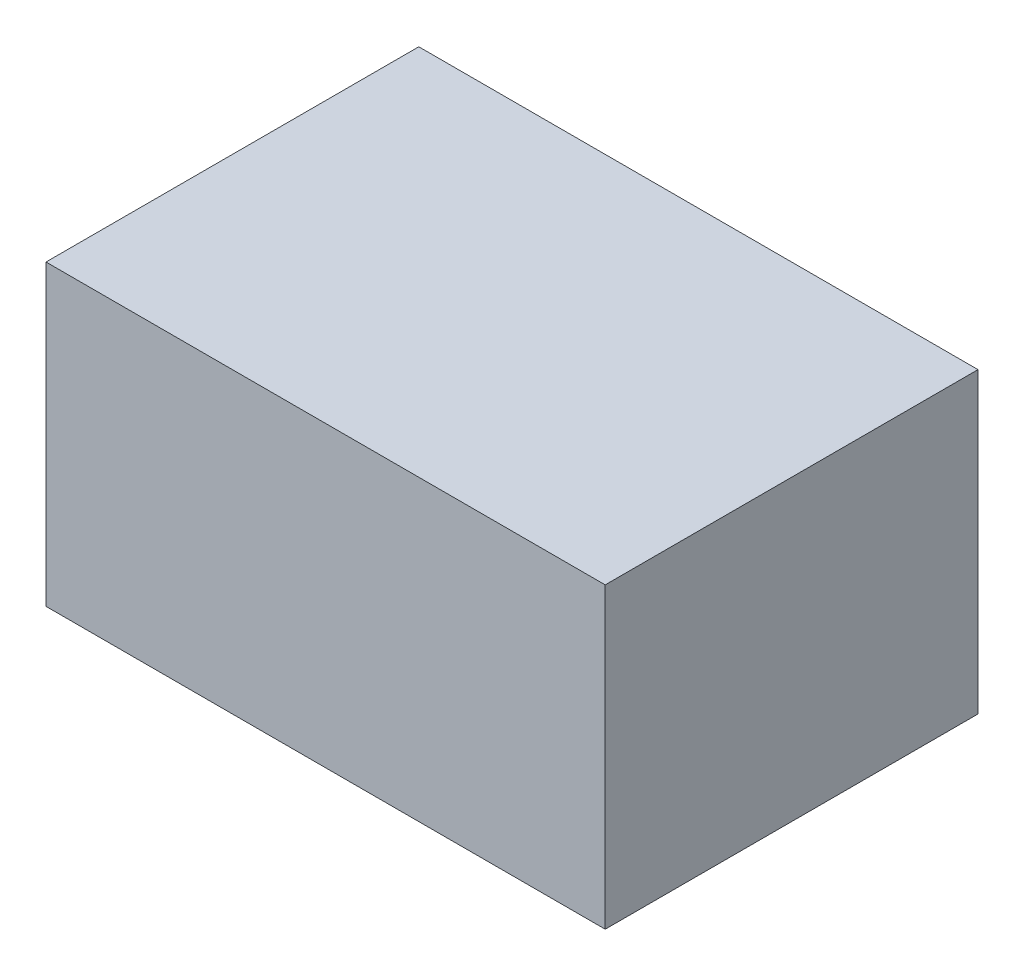
ISO-10303-21;
HEADER;
FILE_DESCRIPTION(('STEP AP214'),'2;1');
FILE_NAME('part.step','',(''),(''),'','','');
FILE_SCHEMA(('AUTOMOTIVE_DESIGN { 1 0 10303 214 1 1 1 1 }'));
ENDSEC;
DATA;
#1=APPLICATION_CONTEXT('core data for automotive mechanical design processes');
#2=APPLICATION_PROTOCOL_DEFINITION('international standard','automotive_design',2000,#1);
#3=PRODUCT_CONTEXT('',#1,'mechanical');
#4=PRODUCT('Part','Part','',(#3));
#5=PRODUCT_RELATED_PRODUCT_CATEGORY('part','',(#4));
#6=PRODUCT_DEFINITION_FORMATION('','',#4);
#7=PRODUCT_DEFINITION_CONTEXT('part definition',#1,'design');
#8=PRODUCT_DEFINITION('design','',#6,#7);
#9=PRODUCT_DEFINITION_SHAPE('','',#8);
#10=(LENGTH_UNIT() NAMED_UNIT(*) SI_UNIT(.MILLI.,.METRE.));
#11=(NAMED_UNIT(*) PLANE_ANGLE_UNIT() SI_UNIT($,.RADIAN.));
#12=(NAMED_UNIT(*) SI_UNIT($,.STERADIAN.) SOLID_ANGLE_UNIT());
#13=UNCERTAINTY_MEASURE_WITH_UNIT(LENGTH_MEASURE(1.E-05),#10,'distance_accuracy_value','');
#14=(GEOMETRIC_REPRESENTATION_CONTEXT(3) GLOBAL_UNCERTAINTY_ASSIGNED_CONTEXT((#13)) GLOBAL_UNIT_ASSIGNED_CONTEXT((#10,
#11,#12)) REPRESENTATION_CONTEXT('',''));
#15=CARTESIAN_POINT('',(0.,0.,0.));
#16=DIRECTION('',(0.,0.,1.));
#17=DIRECTION('',(1.,0.,0.));
#18=AXIS2_PLACEMENT_3D('',#15,#16,#17);
#19=CARTESIAN_POINT('',(75.,40.,-100.));
#20=DIRECTION('',(1.,0.,0.));
#21=DIRECTION('',(0.,0.,-1.));
#22=AXIS2_PLACEMENT_3D('',#19,#20,#21);
#23=PLANE('',#22);
#24=DIRECTION('',(0.,1.,0.));
#25=VECTOR('',#24,1.);
#26=CARTESIAN_POINT('',(75.,40.,0.));
#27=LINE('',#26,#25);
#28=CARTESIAN_POINT('',(75.,-40.,0.));
#29=VERTEX_POINT('',#28);
#30=CARTESIAN_POINT('',(75.,40.,0.));
#31=VERTEX_POINT('',#30);
#32=EDGE_CURVE('E161',#29,#31,#27,.T.);
#33=ORIENTED_EDGE('',*,*,#32,.F.);
#34=DIRECTION('',(0.,0.,1.));
#35=VECTOR('',#34,1.);
#36=CARTESIAN_POINT('',(75.,-40.,-100.));
#37=LINE('',#36,#35);
#38=CARTESIAN_POINT('',(75.,-40.,-100.));
#39=VERTEX_POINT('',#38);
#40=EDGE_CURVE('E14',#39,#29,#37,.T.);
#41=ORIENTED_EDGE('',*,*,#40,.F.);
#42=DIRECTION('',(0.,1.,0.));
#43=VECTOR('',#42,1.);
#44=CARTESIAN_POINT('',(75.,40.,-100.));
#45=LINE('',#44,#43);
#46=CARTESIAN_POINT('',(75.,40.,-100.));
#47=VERTEX_POINT('',#46);
#48=EDGE_CURVE('E155',#39,#47,#45,.T.);
#49=ORIENTED_EDGE('',*,*,#48,.T.);
#50=DIRECTION('',(0.,0.,1.));
#51=VECTOR('',#50,1.);
#52=CARTESIAN_POINT('',(75.,40.,-100.));
#53=LINE('',#52,#51);
#54=EDGE_CURVE('E100',#47,#31,#53,.T.);
#55=ORIENTED_EDGE('',*,*,#54,.T.);
#56=EDGE_LOOP('',(#33,#41,#49,#55));
#57=FACE_BOUND('',#56,.T.);
#58=ADVANCED_FACE('F97',(#57),#23,.T.);
#59=CARTESIAN_POINT('',(-75.,-40.,-100.));
#60=DIRECTION('',(0.,-1.,0.));
#61=DIRECTION('',(0.,0.,-1.));
#62=AXIS2_PLACEMENT_3D('',#59,#60,#61);
#63=PLANE('',#62);
#64=DIRECTION('',(1.,0.,0.));
#65=VECTOR('',#64,1.);
#66=CARTESIAN_POINT('',(-75.,-40.,0.));
#67=LINE('',#66,#65);
#68=CARTESIAN_POINT('',(-75.,-40.,0.));
#69=VERTEX_POINT('',#68);
#70=EDGE_CURVE('E157',#69,#29,#67,.T.);
#71=ORIENTED_EDGE('',*,*,#70,.F.);
#72=DIRECTION('',(0.,0.,1.));
#73=VECTOR('',#72,1.);
#74=CARTESIAN_POINT('',(-75.,-40.,-100.));
#75=LINE('',#74,#73);
#76=CARTESIAN_POINT('',(-75.,-40.,-100.));
#77=VERTEX_POINT('',#76);
#78=EDGE_CURVE('E106',#77,#69,#75,.T.);
#79=ORIENTED_EDGE('',*,*,#78,.F.);
#80=DIRECTION('',(1.,0.,0.));
#81=VECTOR('',#80,1.);
#82=CARTESIAN_POINT('',(-75.,-40.,-100.));
#83=LINE('',#82,#81);
#84=EDGE_CURVE('E152',#77,#39,#83,.T.);
#85=ORIENTED_EDGE('',*,*,#84,.T.);
#86=ORIENTED_EDGE('',*,*,#40,.T.);
#87=EDGE_LOOP('',(#71,#79,#85,#86));
#88=FACE_BOUND('',#87,.T.);
#89=ADVANCED_FACE('F171',(#88),#63,.T.);
#90=CARTESIAN_POINT('',(-75.,40.,-100.));
#91=DIRECTION('',(-1.,0.,0.));
#92=DIRECTION('',(0.,0.,1.));
#93=AXIS2_PLACEMENT_3D('',#90,#91,#92);
#94=PLANE('',#93);
#95=DIRECTION('',(0.,-1.,0.));
#96=VECTOR('',#95,1.);
#97=CARTESIAN_POINT('',(-75.,40.,0.));
#98=LINE('',#97,#96);
#99=CARTESIAN_POINT('',(-75.,40.,0.));
#100=VERTEX_POINT('',#99);
#101=EDGE_CURVE('E147',#100,#69,#98,.T.);
#102=ORIENTED_EDGE('',*,*,#101,.F.);
#103=DIRECTION('',(0.,0.,1.));
#104=VECTOR('',#103,1.);
#105=CARTESIAN_POINT('',(-75.,40.,-100.));
#106=LINE('',#105,#104);
#107=CARTESIAN_POINT('',(-75.,40.,-100.));
#108=VERTEX_POINT('',#107);
#109=EDGE_CURVE('E142',#108,#100,#106,.T.);
#110=ORIENTED_EDGE('',*,*,#109,.F.);
#111=DIRECTION('',(0.,-1.,0.));
#112=VECTOR('',#111,1.);
#113=CARTESIAN_POINT('',(-75.,40.,-100.));
#114=LINE('',#113,#112);
#115=EDGE_CURVE('E145',#108,#77,#114,.T.);
#116=ORIENTED_EDGE('',*,*,#115,.T.);
#117=ORIENTED_EDGE('',*,*,#78,.T.);
#118=EDGE_LOOP('',(#102,#110,#116,#117));
#119=FACE_BOUND('',#118,.T.);
#120=ADVANCED_FACE('F144',(#119),#94,.T.);
#121=CARTESIAN_POINT('',(-75.,40.,-100.));
#122=DIRECTION('',(0.,1.,0.));
#123=DIRECTION('',(0.,0.,1.));
#124=AXIS2_PLACEMENT_3D('',#121,#122,#123);
#125=PLANE('',#124);
#126=DIRECTION('',(-1.,0.,0.));
#127=VECTOR('',#126,1.);
#128=CARTESIAN_POINT('',(-75.,40.,0.));
#129=LINE('',#128,#127);
#130=EDGE_CURVE('E164',#31,#100,#129,.T.);
#131=ORIENTED_EDGE('',*,*,#130,.F.);
#132=ORIENTED_EDGE('',*,*,#54,.F.);
#133=DIRECTION('',(-1.,0.,0.));
#134=VECTOR('',#133,1.);
#135=CARTESIAN_POINT('',(-75.,40.,-100.));
#136=LINE('',#135,#134);
#137=EDGE_CURVE('E151',#47,#108,#136,.T.);
#138=ORIENTED_EDGE('',*,*,#137,.T.);
#139=ORIENTED_EDGE('',*,*,#109,.T.);
#140=EDGE_LOOP('',(#131,#132,#138,#139));
#141=FACE_BOUND('',#140,.T.);
#142=ADVANCED_FACE('F154',(#141),#125,.T.);
#143=CARTESIAN_POINT('',(0.,0.,-100.));
#144=DIRECTION('',(0.,0.,1.));
#145=DIRECTION('',(1.,0.,0.));
#146=AXIS2_PLACEMENT_3D('',#143,#144,#145);
#147=PLANE('',#146);
#148=ORIENTED_EDGE('',*,*,#48,.F.);
#149=ORIENTED_EDGE('',*,*,#84,.F.);
#150=ORIENTED_EDGE('',*,*,#115,.F.);
#151=ORIENTED_EDGE('',*,*,#137,.F.);
#152=EDGE_LOOP('',(#148,#149,#150,#151));
#153=FACE_BOUND('',#152,.T.);
#154=ADVANCED_FACE('F150',(#153),#147,.F.);
#155=CARTESIAN_POINT('',(0.,0.,0.));
#156=DIRECTION('',(0.,0.,1.));
#157=DIRECTION('',(1.,0.,0.));
#158=AXIS2_PLACEMENT_3D('',#155,#156,#157);
#159=PLANE('',#158);
#160=ORIENTED_EDGE('',*,*,#32,.T.);
#161=ORIENTED_EDGE('',*,*,#130,.T.);
#162=ORIENTED_EDGE('',*,*,#101,.T.);
#163=ORIENTED_EDGE('',*,*,#70,.T.);
#164=EDGE_LOOP('',(#160,#161,#162,#163));
#165=FACE_BOUND('',#164,.T.);
#166=ADVANCED_FACE('F170',(#165),#159,.T.);
#167=CLOSED_SHELL('',(#58,#89,#120,#142,#154,#166));
#168=MANIFOLD_SOLID_BREP('B2',#167);
#169=ADVANCED_BREP_SHAPE_REPRESENTATION('',(#18,#168),#14);
#170=SHAPE_DEFINITION_REPRESENTATION(#9,#169);
ENDSEC;
END-ISO-10303-21;
